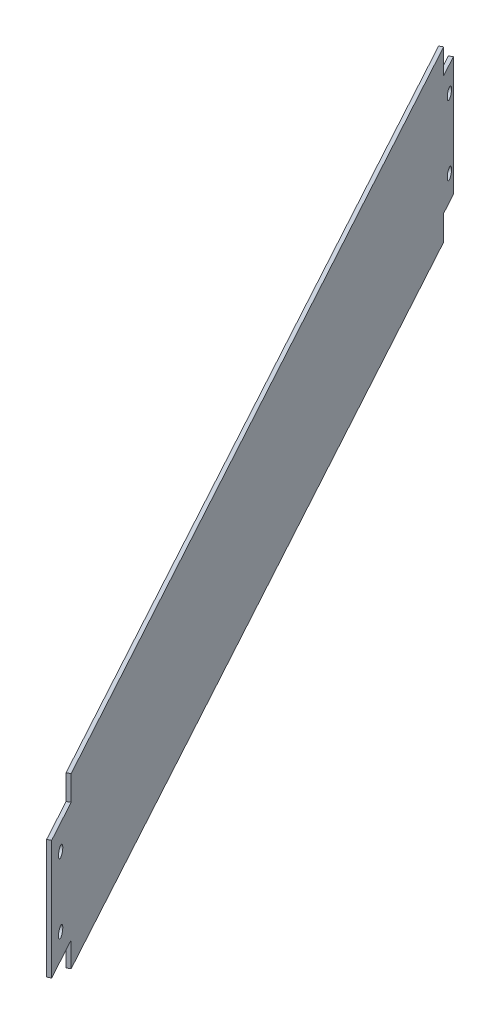
ISO-10303-21;
HEADER;
FILE_DESCRIPTION(('STEP AP214'),'2;1');
FILE_NAME('part.step','',(''),(''),'','','');
FILE_SCHEMA(('AUTOMOTIVE_DESIGN { 1 0 10303 214 1 1 1 1 }'));
ENDSEC;
DATA;
#1=APPLICATION_CONTEXT('core data for automotive mechanical design processes');
#2=APPLICATION_PROTOCOL_DEFINITION('international standard','automotive_design',2000,#1);
#3=PRODUCT_CONTEXT('',#1,'mechanical');
#4=PRODUCT('Part','Part','',(#3));
#5=PRODUCT_RELATED_PRODUCT_CATEGORY('part','',(#4));
#6=PRODUCT_DEFINITION_FORMATION('','',#4);
#7=PRODUCT_DEFINITION_CONTEXT('part definition',#1,'design');
#8=PRODUCT_DEFINITION('design','',#6,#7);
#9=PRODUCT_DEFINITION_SHAPE('','',#8);
#10=(LENGTH_UNIT() NAMED_UNIT(*) SI_UNIT(.MILLI.,.METRE.));
#11=(NAMED_UNIT(*) PLANE_ANGLE_UNIT() SI_UNIT($,.RADIAN.));
#12=(NAMED_UNIT(*) SI_UNIT($,.STERADIAN.) SOLID_ANGLE_UNIT());
#13=UNCERTAINTY_MEASURE_WITH_UNIT(LENGTH_MEASURE(1.E-05),#10,'distance_accuracy_value','');
#14=(GEOMETRIC_REPRESENTATION_CONTEXT(3) GLOBAL_UNCERTAINTY_ASSIGNED_CONTEXT((#13)) GLOBAL_UNIT_ASSIGNED_CONTEXT((#10,
#11,#12)) REPRESENTATION_CONTEXT('',''));
#15=CARTESIAN_POINT('',(0.,0.,0.));
#16=DIRECTION('',(0.,0.,1.));
#17=DIRECTION('',(1.,0.,0.));
#18=AXIS2_PLACEMENT_3D('',#15,#16,#17);
#19=CARTESIAN_POINT('',(63.,24.,-329.5));
#20=DIRECTION('',(0.878709626854143,0.,-0.477356671341097));
#21=DIRECTION('',(-0.477356671341097,0.,-0.878709626854143));
#22=AXIS2_PLACEMENT_3D('',#19,#20,#21);
#23=PLANE('',#22);
#24=DIRECTION('',(-0.477356671341097,0.,-0.878709626854143));
#25=VECTOR('',#24,1.);
#26=CARTESIAN_POINT('',(242.150424046724,-24.,0.276897896064776));
#27=LINE('',#26,#25);
#28=CARTESIAN_POINT('',(250.893268177586,-24.,16.3705690755053));
#29=VERTEX_POINT('',#28);
#30=CARTESIAN_POINT('',(241.574113099408,-24.,-0.783964992988662));
#31=VERTEX_POINT('',#30);
#32=EDGE_CURVE('E253',#29,#31,#27,.T.);
#33=ORIENTED_EDGE('',*,*,#32,.T.);
#34=DIRECTION('',(0.,1.,0.));
#35=VECTOR('',#34,1.);
#36=CARTESIAN_POINT('',(241.574113099408,-25.7671458676443,-0.783964992988717));
#37=LINE('',#36,#35);
#38=CARTESIAN_POINT('',(241.574113099408,-34.0342917352885,-0.783964992988551));
#39=VERTEX_POINT('',#38);
#40=EDGE_CURVE('E323',#31,#39,#37,.F.);
#41=ORIENTED_EDGE('',*,*,#40,.T.);
#42=DIRECTION('',(-0.477356671341098,0.,-0.878709626854143));
#43=VECTOR('',#42,1.);
#44=CARTESIAN_POINT('',(186.855607214927,-34.0342917352885,-101.508812417214));
#45=LINE('',#44,#43);
#46=CARTESIAN_POINT('',(63.1819355597183,-34.0342917352885,-329.165096274149));
#47=VERTEX_POINT('',#46);
#48=EDGE_CURVE('E315',#39,#47,#45,.T.);
#49=ORIENTED_EDGE('',*,*,#48,.T.);
#50=DIRECTION('',(0.,1.,0.));
#51=VECTOR('',#50,1.);
#52=CARTESIAN_POINT('',(63.1819355597188,-25.7671458676443,-329.165096274149));
#53=LINE('',#52,#51);
#54=CARTESIAN_POINT('',(63.1819355597188,-24.,-329.165096274149));
#55=VERTEX_POINT('',#54);
#56=EDGE_CURVE('E325',#47,#55,#53,.T.);
#57=ORIENTED_EDGE('',*,*,#56,.T.);
#58=DIRECTION('',(-0.477356671341097,0.,-0.878709626854143));
#59=VECTOR('',#58,1.);
#60=CARTESIAN_POINT('',(62.9146876378817,-24.,-329.65704147105));
#61=LINE('',#60,#59);
#62=CARTESIAN_POINT('',(58.5331652336936,-24.,-337.722469583788));
#63=VERTEX_POINT('',#62);
#64=EDGE_CURVE('E282',#55,#63,#61,.T.);
#65=ORIENTED_EDGE('',*,*,#64,.T.);
#66=DIRECTION('',(0.,-1.,0.));
#67=VECTOR('',#66,1.);
#68=CARTESIAN_POINT('',(58.5331652336936,24.,-337.722469583788));
#69=LINE('',#68,#67);
#70=CARTESIAN_POINT('',(58.5331652336936,24.,-337.722469583788));
#71=VERTEX_POINT('',#70);
#72=EDGE_CURVE('E277',#71,#63,#69,.T.);
#73=ORIENTED_EDGE('',*,*,#72,.F.);
#74=DIRECTION('',(-0.477356671341097,0.,-0.878709626854143));
#75=VECTOR('',#74,1.);
#76=CARTESIAN_POINT('',(62.9146876378817,24.,-329.65704147105));
#77=LINE('',#76,#75);
#78=CARTESIAN_POINT('',(63.1819355597188,24.,-329.165096274149));
#79=VERTEX_POINT('',#78);
#80=EDGE_CURVE('E284',#71,#79,#77,.F.);
#81=ORIENTED_EDGE('',*,*,#80,.T.);
#82=DIRECTION('',(0.,1.,0.));
#83=VECTOR('',#82,1.);
#84=CARTESIAN_POINT('',(63.1819355597188,25.7671458676443,-329.165096274149));
#85=LINE('',#84,#83);
#86=CARTESIAN_POINT('',(63.1819355597179,34.0342917352885,-329.165096274149));
#87=VERTEX_POINT('',#86);
#88=EDGE_CURVE('E302',#79,#87,#85,.T.);
#89=ORIENTED_EDGE('',*,*,#88,.T.);
#90=DIRECTION('',(0.477356671341098,0.,0.878709626854143));
#91=VECTOR('',#90,1.);
#92=CARTESIAN_POINT('',(186.855607214927,34.0342917352885,-101.508812417214));
#93=LINE('',#92,#91);
#94=CARTESIAN_POINT('',(241.574113099407,34.0342917352885,-0.783964992988329));
#95=VERTEX_POINT('',#94);
#96=EDGE_CURVE('E294',#87,#95,#93,.T.);
#97=ORIENTED_EDGE('',*,*,#96,.T.);
#98=DIRECTION('',(0.,1.,0.));
#99=VECTOR('',#98,1.);
#100=CARTESIAN_POINT('',(241.574113099408,25.7671458676443,-0.783964992988717));
#101=LINE('',#100,#99);
#102=CARTESIAN_POINT('',(241.574113099408,24.,-0.783964992988662));
#103=VERTEX_POINT('',#102);
#104=EDGE_CURVE('E304',#95,#103,#101,.F.);
#105=ORIENTED_EDGE('',*,*,#104,.T.);
#106=DIRECTION('',(-0.477356671341097,0.,-0.878709626854143));
#107=VECTOR('',#106,1.);
#108=CARTESIAN_POINT('',(242.150424046724,24.,0.276897896064776));
#109=LINE('',#108,#107);
#110=CARTESIAN_POINT('',(250.893268177586,24.,16.3705690755053));
#111=VERTEX_POINT('',#110);
#112=EDGE_CURVE('E251',#103,#111,#109,.F.);
#113=ORIENTED_EDGE('',*,*,#112,.T.);
#114=DIRECTION('',(0.,-1.,0.));
#115=VECTOR('',#114,1.);
#116=CARTESIAN_POINT('',(250.893268177586,24.,16.3705690755053));
#117=LINE('',#116,#115);
#118=EDGE_CURVE('E247',#111,#29,#117,.T.);
#119=ORIENTED_EDGE('',*,*,#118,.T.);
#120=EDGE_LOOP('',(#33,#41,#49,#57,#65,#73,#81,#89,#97,#105,#113,#119));
#121=FACE_BOUND('',#120,.T.);
#122=CARTESIAN_POINT('',(60.4425919190579,14.,-334.207631076371));
#123=DIRECTION('',(0.878709626854152,0.,-0.477356671341081));
#124=DIRECTION('',(-0.477356671341081,0.,-0.878709626854152));
#125=AXIS2_PLACEMENT_3D('',#122,#123,#124);
#126=CIRCLE('',#125,2.15);
#127=CARTESIAN_POINT('',(59.4162750756746,14.,-336.096856774108));
#128=VERTEX_POINT('',#127);
#129=EDGE_CURVE('E271',#128,#128,#126,.T.);
#130=ORIENTED_EDGE('',*,*,#129,.F.);
#131=EDGE_LOOP('',(#130));
#132=FACE_BOUND('',#131,.T.);
#133=CARTESIAN_POINT('',(60.4425919190579,-14.,-334.207631076371));
#134=DIRECTION('',(0.878709626854152,0.,-0.477356671341081));
#135=DIRECTION('',(-0.477356671341081,0.,-0.878709626854152));
#136=AXIS2_PLACEMENT_3D('',#133,#134,#135);
#137=CIRCLE('',#136,2.15);
#138=CARTESIAN_POINT('',(59.4162750756746,-14.,-336.096856774108));
#139=VERTEX_POINT('',#138);
#140=EDGE_CURVE('E274',#139,#139,#137,.T.);
#141=ORIENTED_EDGE('',*,*,#140,.F.);
#142=EDGE_LOOP('',(#141));
#143=FACE_BOUND('',#142,.T.);
#144=CARTESIAN_POINT('',(246.597058135517,14.,8.46218243381747));
#145=DIRECTION('',(0.8787096268542,0.,-0.477356671340993));
#146=DIRECTION('',(-0.477356671340993,0.,-0.8787096268542));
#147=AXIS2_PLACEMENT_3D('',#144,#145,#146);
#148=CIRCLE('',#147,2.14999999999999);
#149=CARTESIAN_POINT('',(245.570741292134,14.,6.57295673608095));
#150=VERTEX_POINT('',#149);
#151=EDGE_CURVE('E371',#150,#150,#148,.T.);
#152=ORIENTED_EDGE('',*,*,#151,.F.);
#153=EDGE_LOOP('',(#152));
#154=FACE_BOUND('',#153,.T.);
#155=CARTESIAN_POINT('',(246.597058135517,-14.,8.46218243381747));
#156=DIRECTION('',(0.8787096268542,0.,-0.477356671340993));
#157=DIRECTION('',(-0.477356671340993,0.,-0.8787096268542));
#158=AXIS2_PLACEMENT_3D('',#155,#156,#157);
#159=CIRCLE('',#158,2.14999999999999);
#160=CARTESIAN_POINT('',(245.570741292134,-14.,6.57295673608095));
#161=VERTEX_POINT('',#160);
#162=EDGE_CURVE('E242',#161,#161,#159,.T.);
#163=ORIENTED_EDGE('',*,*,#162,.F.);
#164=EDGE_LOOP('',(#163));
#165=FACE_BOUND('',#164,.T.);
#166=ADVANCED_FACE('F137',(#121,#132,#143,#154,#165),#23,.T.);
#167=CARTESIAN_POINT('',(61.6819355597188,24.,-328.783964992988));
#168=DIRECTION('',(0.878709626854143,0.,-0.477356671341097));
#169=DIRECTION('',(-0.477356671341097,0.,-0.878709626854143));
#170=AXIS2_PLACEMENT_3D('',#167,#168,#169);
#171=PLANE('',#170);
#172=DIRECTION('',(-0.477356671341097,0.,-0.878709626854143));
#173=VECTOR('',#172,1.);
#174=CARTESIAN_POINT('',(61.5966231976005,-24.,-328.941006464039));
#175=LINE('',#174,#173);
#176=CARTESIAN_POINT('',(61.8638711194376,-24.,-328.449061267137));
#177=VERTEX_POINT('',#176);
#178=CARTESIAN_POINT('',(57.2151007934123,-24.,-337.006434576776));
#179=VERTEX_POINT('',#178);
#180=EDGE_CURVE('E261',#177,#179,#175,.T.);
#181=ORIENTED_EDGE('',*,*,#180,.F.);
#182=DIRECTION('',(0.,1.,0.));
#183=VECTOR('',#182,1.);
#184=CARTESIAN_POINT('',(61.8638711194376,-25.7671458676443,-328.449061267137));
#185=LINE('',#184,#183);
#186=CARTESIAN_POINT('',(61.8638711194371,-34.0342917352885,-328.449061267137));
#187=VERTEX_POINT('',#186);
#188=EDGE_CURVE('E326',#187,#177,#185,.T.);
#189=ORIENTED_EDGE('',*,*,#188,.F.);
#190=DIRECTION('',(0.477356671341098,0.,0.878709626854143));
#191=VECTOR('',#190,1.);
#192=CARTESIAN_POINT('',(61.8638711194371,-34.0342917352885,-328.449061267137));
#193=LINE('',#192,#191);
#194=CARTESIAN_POINT('',(240.256048659127,-34.0342917352885,-0.0679299859768778));
#195=VERTEX_POINT('',#194);
#196=EDGE_CURVE('E308',#195,#187,#193,.F.);
#197=ORIENTED_EDGE('',*,*,#196,.F.);
#198=DIRECTION('',(0.,1.,0.));
#199=VECTOR('',#198,1.);
#200=CARTESIAN_POINT('',(240.256048659127,-25.7671458676443,-0.0679299859770999));
#201=LINE('',#200,#199);
#202=CARTESIAN_POINT('',(240.256048659127,-24.,-0.0679299859770999));
#203=VERTEX_POINT('',#202);
#204=EDGE_CURVE('E314',#203,#195,#201,.F.);
#205=ORIENTED_EDGE('',*,*,#204,.F.);
#206=DIRECTION('',(-0.477356671341097,0.,-0.878709626854143));
#207=VECTOR('',#206,1.);
#208=CARTESIAN_POINT('',(240.832359606443,-24.,0.992932903076393));
#209=LINE('',#208,#207);
#210=CARTESIAN_POINT('',(249.575203737305,-24.,17.0866040825167));
#211=VERTEX_POINT('',#210);
#212=EDGE_CURVE('E151',#211,#203,#209,.T.);
#213=ORIENTED_EDGE('',*,*,#212,.F.);
#214=DIRECTION('',(0.,-1.,0.));
#215=VECTOR('',#214,1.);
#216=CARTESIAN_POINT('',(249.575203737305,24.,17.0866040825167));
#217=LINE('',#216,#215);
#218=CARTESIAN_POINT('',(249.575203737305,24.,17.0866040825167));
#219=VERTEX_POINT('',#218);
#220=EDGE_CURVE('E236',#219,#211,#217,.T.);
#221=ORIENTED_EDGE('',*,*,#220,.F.);
#222=DIRECTION('',(-0.477356671341097,0.,-0.878709626854143));
#223=VECTOR('',#222,1.);
#224=CARTESIAN_POINT('',(240.832359606443,24.,0.992932903076393));
#225=LINE('',#224,#223);
#226=CARTESIAN_POINT('',(240.256048659127,24.,-0.0679299859770444));
#227=VERTEX_POINT('',#226);
#228=EDGE_CURVE('E225',#227,#219,#225,.F.);
#229=ORIENTED_EDGE('',*,*,#228,.F.);
#230=DIRECTION('',(0.,1.,0.));
#231=VECTOR('',#230,1.);
#232=CARTESIAN_POINT('',(240.256048659127,25.7671458676443,-0.0679299859770444));
#233=LINE('',#232,#231);
#234=CARTESIAN_POINT('',(240.256048659126,34.0342917352885,-0.0679299859766558));
#235=VERTEX_POINT('',#234);
#236=EDGE_CURVE('E305',#235,#227,#233,.F.);
#237=ORIENTED_EDGE('',*,*,#236,.F.);
#238=DIRECTION('',(-0.477356671341098,0.,-0.878709626854143));
#239=VECTOR('',#238,1.);
#240=CARTESIAN_POINT('',(240.256048659126,34.0342917352885,-0.0679299859766558));
#241=LINE('',#240,#239);
#242=CARTESIAN_POINT('',(61.8638711194367,34.0342917352885,-328.449061267137));
#243=VERTEX_POINT('',#242);
#244=EDGE_CURVE('E287',#243,#235,#241,.F.);
#245=ORIENTED_EDGE('',*,*,#244,.F.);
#246=DIRECTION('',(0.,1.,0.));
#247=VECTOR('',#246,1.);
#248=CARTESIAN_POINT('',(61.8638711194376,25.7671458676443,-328.449061267137));
#249=LINE('',#248,#247);
#250=CARTESIAN_POINT('',(61.8638711194367,24.,-328.449061267137));
#251=VERTEX_POINT('',#250);
#252=EDGE_CURVE('E293',#251,#243,#249,.T.);
#253=ORIENTED_EDGE('',*,*,#252,.F.);
#254=DIRECTION('',(-0.477356671341097,0.,-0.878709626854143));
#255=VECTOR('',#254,1.);
#256=CARTESIAN_POINT('',(61.5966231976005,24.,-328.941006464039));
#257=LINE('',#256,#255);
#258=CARTESIAN_POINT('',(57.2151007934123,24.,-337.006434576776));
#259=VERTEX_POINT('',#258);
#260=EDGE_CURVE('E159',#259,#251,#257,.F.);
#261=ORIENTED_EDGE('',*,*,#260,.F.);
#262=DIRECTION('',(0.,-1.,0.));
#263=VECTOR('',#262,1.);
#264=CARTESIAN_POINT('',(57.2151007934123,24.,-337.006434576776));
#265=LINE('',#264,#263);
#266=EDGE_CURVE('E258',#259,#179,#265,.T.);
#267=ORIENTED_EDGE('',*,*,#266,.T.);
#268=EDGE_LOOP('',(#181,#189,#197,#205,#213,#221,#229,#237,#245,#253,#261,#267));
#269=FACE_BOUND('',#268,.T.);
#270=CARTESIAN_POINT('',(59.1245274787767,14.,-333.49159606936));
#271=DIRECTION('',(0.878709626854152,0.,-0.477356671341081));
#272=DIRECTION('',(-0.477356671341081,0.,-0.878709626854152));
#273=AXIS2_PLACEMENT_3D('',#270,#271,#272);
#274=CIRCLE('',#273,2.15);
#275=CARTESIAN_POINT('',(58.0982106353934,14.,-335.380821767096));
#276=VERTEX_POINT('',#275);
#277=EDGE_CURVE('E265',#276,#276,#274,.T.);
#278=ORIENTED_EDGE('',*,*,#277,.T.);
#279=EDGE_LOOP('',(#278));
#280=FACE_BOUND('',#279,.T.);
#281=CARTESIAN_POINT('',(59.1245274787767,-14.,-333.49159606936));
#282=DIRECTION('',(0.878709626854152,0.,-0.477356671341081));
#283=DIRECTION('',(-0.477356671341081,0.,-0.878709626854152));
#284=AXIS2_PLACEMENT_3D('',#281,#282,#283);
#285=CIRCLE('',#284,2.15);
#286=CARTESIAN_POINT('',(58.0982106353934,-14.,-335.380821767096));
#287=VERTEX_POINT('',#286);
#288=EDGE_CURVE('E262',#287,#287,#285,.T.);
#289=ORIENTED_EDGE('',*,*,#288,.T.);
#290=EDGE_LOOP('',(#289));
#291=FACE_BOUND('',#290,.T.);
#292=CARTESIAN_POINT('',(245.278993695236,14.,9.17821744082892));
#293=DIRECTION('',(0.8787096268542,0.,-0.477356671340993));
#294=DIRECTION('',(-0.477356671340993,0.,-0.8787096268542));
#295=AXIS2_PLACEMENT_3D('',#292,#293,#294);
#296=CIRCLE('',#295,2.14999999999999);
#297=CARTESIAN_POINT('',(244.252676851853,14.,7.2889917430924));
#298=VERTEX_POINT('',#297);
#299=EDGE_CURVE('E370',#298,#298,#296,.T.);
#300=ORIENTED_EDGE('',*,*,#299,.T.);
#301=EDGE_LOOP('',(#300));
#302=FACE_BOUND('',#301,.T.);
#303=CARTESIAN_POINT('',(245.278993695236,-14.,9.17821744082892));
#304=DIRECTION('',(0.8787096268542,0.,-0.477356671340993));
#305=DIRECTION('',(-0.477356671340993,0.,-0.8787096268542));
#306=AXIS2_PLACEMENT_3D('',#303,#304,#305);
#307=CIRCLE('',#306,2.14999999999999);
#308=CARTESIAN_POINT('',(244.252676851853,-14.,7.2889917430924));
#309=VERTEX_POINT('',#308);
#310=EDGE_CURVE('E373',#309,#309,#307,.T.);
#311=ORIENTED_EDGE('',*,*,#310,.T.);
#312=EDGE_LOOP('',(#311));
#313=FACE_BOUND('',#312,.T.);
#314=ADVANCED_FACE('F238',(#269,#280,#291,#302,#313),#171,.F.);
#315=CARTESIAN_POINT('',(240.915080879268,-25.7671458676443,-0.425947489482936));
#316=DIRECTION('',(-0.477356671341097,0.,-0.878709626854143));
#317=DIRECTION('',(0.,1.,0.));
#318=AXIS2_PLACEMENT_3D('',#315,#316,#317);
#319=PLANE('',#318);
#320=DIRECTION('',(-0.878709626854203,0.,0.477356671340988));
#321=VECTOR('',#320,1.);
#322=CARTESIAN_POINT('',(241.574113099408,-24.,-0.783964992988606));
#323=LINE('',#322,#321);
#324=EDGE_CURVE('E13',#31,#203,#323,.T.);
#325=ORIENTED_EDGE('',*,*,#324,.T.);
#326=ORIENTED_EDGE('',*,*,#204,.T.);
#327=DIRECTION('',(-0.878709626854143,0.,0.477356671341098));
#328=VECTOR('',#327,1.);
#329=CARTESIAN_POINT('',(241.574113099408,-34.0342917352885,-0.783964992988551));
#330=LINE('',#329,#328);
#331=EDGE_CURVE('E318',#39,#195,#330,.T.);
#332=ORIENTED_EDGE('',*,*,#331,.F.);
#333=ORIENTED_EDGE('',*,*,#40,.F.);
#334=EDGE_LOOP('',(#325,#326,#332,#333));
#335=FACE_BOUND('',#334,.T.);
#336=ADVANCED_FACE('F368',(#335),#319,.F.);
#337=CARTESIAN_POINT('',(62.5229033395782,-25.7671458676443,-328.807078770643));
#338=DIRECTION('',(-0.477356671341097,0.,-0.878709626854143));
#339=DIRECTION('',(0.,1.,0.));
#340=AXIS2_PLACEMENT_3D('',#337,#338,#339);
#341=PLANE('',#340);
#342=ORIENTED_EDGE('',*,*,#188,.T.);
#343=DIRECTION('',(0.878709626854136,0.,-0.477356671341111));
#344=VECTOR('',#343,1.);
#345=CARTESIAN_POINT('',(61.8638711194376,-24.,-328.449061267137));
#346=LINE('',#345,#344);
#347=EDGE_CURVE('E329',#177,#55,#346,.T.);
#348=ORIENTED_EDGE('',*,*,#347,.T.);
#349=ORIENTED_EDGE('',*,*,#56,.F.);
#350=DIRECTION('',(-0.878709626854143,0.,0.477356671341098));
#351=VECTOR('',#350,1.);
#352=CARTESIAN_POINT('',(63.1819355597183,-34.0342917352885,-329.165096274149));
#353=LINE('',#352,#351);
#354=EDGE_CURVE('E311',#47,#187,#353,.T.);
#355=ORIENTED_EDGE('',*,*,#354,.T.);
#356=EDGE_LOOP('',(#342,#348,#349,#355));
#357=FACE_BOUND('',#356,.T.);
#358=ADVANCED_FACE('F360',(#357),#341,.T.);
#359=CARTESIAN_POINT('',(63.1819355597183,-34.0342917352885,-329.165096274149));
#360=DIRECTION('',(0.,1.,0.));
#361=DIRECTION('',(-0.477356671341098,0.,-0.878709626854143));
#362=AXIS2_PLACEMENT_3D('',#359,#360,#361);
#363=PLANE('',#362);
#364=ORIENTED_EDGE('',*,*,#196,.T.);
#365=ORIENTED_EDGE('',*,*,#354,.F.);
#366=ORIENTED_EDGE('',*,*,#48,.F.);
#367=ORIENTED_EDGE('',*,*,#331,.T.);
#368=EDGE_LOOP('',(#364,#365,#366,#367));
#369=FACE_BOUND('',#368,.T.);
#370=ADVANCED_FACE('F364',(#369),#363,.F.);
#371=CARTESIAN_POINT('',(62.5229033395782,25.7671458676443,-328.807078770643));
#372=DIRECTION('',(-0.477356671341097,0.,-0.878709626854143));
#373=DIRECTION('',(0.,1.,0.));
#374=AXIS2_PLACEMENT_3D('',#371,#372,#373);
#375=PLANE('',#374);
#376=DIRECTION('',(-0.878709626854136,0.,0.477356671341111));
#377=VECTOR('',#376,1.);
#378=CARTESIAN_POINT('',(63.1819355597188,24.,-329.165096274149));
#379=LINE('',#378,#377);
#380=EDGE_CURVE('E335',#79,#251,#379,.T.);
#381=ORIENTED_EDGE('',*,*,#380,.T.);
#382=ORIENTED_EDGE('',*,*,#252,.T.);
#383=DIRECTION('',(-0.878709626854143,0.,0.477356671341098));
#384=VECTOR('',#383,1.);
#385=CARTESIAN_POINT('',(63.181935559718,34.0342917352885,-329.165096274148));
#386=LINE('',#385,#384);
#387=EDGE_CURVE('E297',#87,#243,#386,.T.);
#388=ORIENTED_EDGE('',*,*,#387,.F.);
#389=ORIENTED_EDGE('',*,*,#88,.F.);
#390=EDGE_LOOP('',(#381,#382,#388,#389));
#391=FACE_BOUND('',#390,.T.);
#392=ADVANCED_FACE('F347',(#391),#375,.T.);
#393=CARTESIAN_POINT('',(240.915080879268,25.7671458676443,-0.425947489482881));
#394=DIRECTION('',(-0.477356671341097,0.,-0.878709626854143));
#395=DIRECTION('',(0.,1.,0.));
#396=AXIS2_PLACEMENT_3D('',#393,#394,#395);
#397=PLANE('',#396);
#398=ORIENTED_EDGE('',*,*,#236,.T.);
#399=DIRECTION('',(0.878709626854203,0.,-0.477356671340988));
#400=VECTOR('',#399,1.);
#401=CARTESIAN_POINT('',(240.256048659127,24.,-0.0679299859770999));
#402=LINE('',#401,#400);
#403=EDGE_CURVE('E144',#227,#103,#402,.T.);
#404=ORIENTED_EDGE('',*,*,#403,.T.);
#405=ORIENTED_EDGE('',*,*,#104,.F.);
#406=DIRECTION('',(-0.878709626854143,0.,0.477356671341098));
#407=VECTOR('',#406,1.);
#408=CARTESIAN_POINT('',(241.574113099407,34.0342917352885,-0.783964992988329));
#409=LINE('',#408,#407);
#410=EDGE_CURVE('E290',#95,#235,#409,.T.);
#411=ORIENTED_EDGE('',*,*,#410,.T.);
#412=EDGE_LOOP('',(#398,#404,#405,#411));
#413=FACE_BOUND('',#412,.T.);
#414=ADVANCED_FACE('F338',(#413),#397,.F.);
#415=CARTESIAN_POINT('',(241.574113099407,34.0342917352885,-0.783964992988329));
#416=DIRECTION('',(0.,-1.,0.));
#417=DIRECTION('',(-0.477356671341098,0.,-0.878709626854143));
#418=AXIS2_PLACEMENT_3D('',#415,#416,#417);
#419=PLANE('',#418);
#420=ORIENTED_EDGE('',*,*,#244,.T.);
#421=ORIENTED_EDGE('',*,*,#410,.F.);
#422=ORIENTED_EDGE('',*,*,#96,.F.);
#423=ORIENTED_EDGE('',*,*,#387,.T.);
#424=EDGE_LOOP('',(#420,#421,#422,#423));
#425=FACE_BOUND('',#424,.T.);
#426=ADVANCED_FACE('F342',(#425),#419,.F.);
#427=CARTESIAN_POINT('',(62.2556554177411,-24.,-329.299023967544));
#428=DIRECTION('',(0.,-1.,0.));
#429=DIRECTION('',(-0.477356671341097,0.,-0.878709626854143));
#430=AXIS2_PLACEMENT_3D('',#427,#428,#429);
#431=PLANE('',#430);
#432=ORIENTED_EDGE('',*,*,#347,.F.);
#433=ORIENTED_EDGE('',*,*,#180,.T.);
#434=DIRECTION('',(0.878709626854152,0.,-0.477356671341081));
#435=VECTOR('',#434,1.);
#436=CARTESIAN_POINT('',(57.2151007934123,-24.,-337.006434576776));
#437=LINE('',#436,#435);
#438=EDGE_CURVE('E268',#179,#63,#437,.T.);
#439=ORIENTED_EDGE('',*,*,#438,.T.);
#440=ORIENTED_EDGE('',*,*,#64,.F.);
#441=EDGE_LOOP('',(#432,#433,#439,#440));
#442=FACE_BOUND('',#441,.T.);
#443=ADVANCED_FACE('F357',(#442),#431,.T.);
#444=CARTESIAN_POINT('',(62.2556554177411,24.,-329.299023967544));
#445=DIRECTION('',(0.,-1.,0.));
#446=DIRECTION('',(-0.477356671341097,0.,-0.878709626854143));
#447=AXIS2_PLACEMENT_3D('',#444,#445,#446);
#448=PLANE('',#447);
#449=ORIENTED_EDGE('',*,*,#260,.T.);
#450=ORIENTED_EDGE('',*,*,#380,.F.);
#451=ORIENTED_EDGE('',*,*,#80,.F.);
#452=DIRECTION('',(0.878709626854152,0.,-0.477356671341081));
#453=VECTOR('',#452,1.);
#454=CARTESIAN_POINT('',(57.2151007934123,24.,-337.006434576776));
#455=LINE('',#454,#453);
#456=EDGE_CURVE('E255',#259,#71,#455,.T.);
#457=ORIENTED_EDGE('',*,*,#456,.F.);
#458=EDGE_LOOP('',(#449,#450,#451,#457));
#459=FACE_BOUND('',#458,.T.);
#460=ADVANCED_FACE('F352',(#459),#448,.F.);
#461=CARTESIAN_POINT('',(57.2151007934123,24.,-337.006434576776));
#462=DIRECTION('',(-0.477356671341081,0.,-0.878709626854152));
#463=DIRECTION('',(-0.878709626854152,0.,0.477356671341081));
#464=AXIS2_PLACEMENT_3D('',#461,#462,#463);
#465=PLANE('',#464);
#466=ORIENTED_EDGE('',*,*,#438,.F.);
#467=ORIENTED_EDGE('',*,*,#266,.F.);
#468=ORIENTED_EDGE('',*,*,#456,.T.);
#469=ORIENTED_EDGE('',*,*,#72,.T.);
#470=EDGE_LOOP('',(#466,#467,#468,#469));
#471=FACE_BOUND('',#470,.T.);
#472=ADVANCED_FACE('F351',(#471),#465,.T.);
#473=CARTESIAN_POINT('',(60.4425919190579,-14.,-334.207631076371));
#474=DIRECTION('',(0.878709626854152,0.,-0.477356671341081));
#475=DIRECTION('',(-0.477356671341081,0.,-0.878709626854152));
#476=AXIS2_PLACEMENT_3D('',#473,#474,#475);
#477=CYLINDRICAL_SURFACE('',#476,2.15);
#478=ORIENTED_EDGE('',*,*,#288,.F.);
#479=EDGE_LOOP('',(#478));
#480=FACE_BOUND('',#479,.T.);
#481=ORIENTED_EDGE('',*,*,#140,.T.);
#482=EDGE_LOOP('',(#481));
#483=FACE_BOUND('',#482,.T.);
#484=ADVANCED_FACE('F412',(#480,#483),#477,.F.);
#485=CARTESIAN_POINT('',(60.4425919190579,14.,-334.207631076371));
#486=DIRECTION('',(0.878709626854152,0.,-0.477356671341081));
#487=DIRECTION('',(-0.477356671341081,0.,-0.878709626854152));
#488=AXIS2_PLACEMENT_3D('',#485,#486,#487);
#489=CYLINDRICAL_SURFACE('',#488,2.15);
#490=ORIENTED_EDGE('',*,*,#277,.F.);
#491=EDGE_LOOP('',(#490));
#492=FACE_BOUND('',#491,.T.);
#493=ORIENTED_EDGE('',*,*,#129,.T.);
#494=EDGE_LOOP('',(#493));
#495=FACE_BOUND('',#494,.T.);
#496=ADVANCED_FACE('F409',(#492,#495),#489,.F.);
#497=CARTESIAN_POINT('',(241.491391826584,24.,0.634915399570612));
#498=DIRECTION('',(0.,-1.,0.));
#499=DIRECTION('',(-0.477356671341097,0.,-0.878709626854143));
#500=AXIS2_PLACEMENT_3D('',#497,#498,#499);
#501=PLANE('',#500);
#502=ORIENTED_EDGE('',*,*,#403,.F.);
#503=ORIENTED_EDGE('',*,*,#228,.T.);
#504=DIRECTION('',(-0.8787096268542,0.,0.477356671340993));
#505=VECTOR('',#504,1.);
#506=CARTESIAN_POINT('',(250.893268177586,24.,16.3705690755053));
#507=LINE('',#506,#505);
#508=EDGE_CURVE('E229',#111,#219,#507,.T.);
#509=ORIENTED_EDGE('',*,*,#508,.F.);
#510=ORIENTED_EDGE('',*,*,#112,.F.);
#511=EDGE_LOOP('',(#502,#503,#509,#510));
#512=FACE_BOUND('',#511,.T.);
#513=ADVANCED_FACE('F227',(#512),#501,.F.);
#514=CARTESIAN_POINT('',(241.491391826584,-24.,0.634915399570612));
#515=DIRECTION('',(0.,-1.,0.));
#516=DIRECTION('',(-0.477356671341097,0.,-0.878709626854143));
#517=AXIS2_PLACEMENT_3D('',#514,#515,#516);
#518=PLANE('',#517);
#519=ORIENTED_EDGE('',*,*,#212,.T.);
#520=ORIENTED_EDGE('',*,*,#324,.F.);
#521=ORIENTED_EDGE('',*,*,#32,.F.);
#522=DIRECTION('',(-0.8787096268542,0.,0.477356671340993));
#523=VECTOR('',#522,1.);
#524=CARTESIAN_POINT('',(250.893268177586,-24.,16.3705690755053));
#525=LINE('',#524,#523);
#526=EDGE_CURVE('E233',#29,#211,#525,.T.);
#527=ORIENTED_EDGE('',*,*,#526,.T.);
#528=EDGE_LOOP('',(#519,#520,#521,#527));
#529=FACE_BOUND('',#528,.T.);
#530=ADVANCED_FACE('F369',(#529),#518,.T.);
#531=CARTESIAN_POINT('',(250.893268177586,24.,16.3705690755053));
#532=DIRECTION('',(0.477356671340993,0.,0.8787096268542));
#533=DIRECTION('',(0.8787096268542,0.,-0.477356671340993));
#534=AXIS2_PLACEMENT_3D('',#531,#532,#533);
#535=PLANE('',#534);
#536=ORIENTED_EDGE('',*,*,#526,.F.);
#537=ORIENTED_EDGE('',*,*,#118,.F.);
#538=ORIENTED_EDGE('',*,*,#508,.T.);
#539=ORIENTED_EDGE('',*,*,#220,.T.);
#540=EDGE_LOOP('',(#536,#537,#538,#539));
#541=FACE_BOUND('',#540,.T.);
#542=ADVANCED_FACE('F245',(#541),#535,.T.);
#543=CARTESIAN_POINT('',(246.597058135517,-14.,8.46218243381747));
#544=DIRECTION('',(0.8787096268542,0.,-0.477356671340993));
#545=DIRECTION('',(-0.477356671340993,0.,-0.8787096268542));
#546=AXIS2_PLACEMENT_3D('',#543,#544,#545);
#547=CYLINDRICAL_SURFACE('',#546,2.14999999999999);
#548=ORIENTED_EDGE('',*,*,#310,.F.);
#549=EDGE_LOOP('',(#548));
#550=FACE_BOUND('',#549,.T.);
#551=ORIENTED_EDGE('',*,*,#162,.T.);
#552=EDGE_LOOP('',(#551));
#553=FACE_BOUND('',#552,.T.);
#554=ADVANCED_FACE('F384',(#550,#553),#547,.F.);
#555=CARTESIAN_POINT('',(246.597058135517,14.,8.46218243381747));
#556=DIRECTION('',(0.8787096268542,0.,-0.477356671340993));
#557=DIRECTION('',(-0.477356671340993,0.,-0.8787096268542));
#558=AXIS2_PLACEMENT_3D('',#555,#556,#557);
#559=CYLINDRICAL_SURFACE('',#558,2.14999999999999);
#560=ORIENTED_EDGE('',*,*,#299,.F.);
#561=EDGE_LOOP('',(#560));
#562=FACE_BOUND('',#561,.T.);
#563=ORIENTED_EDGE('',*,*,#151,.T.);
#564=EDGE_LOOP('',(#563));
#565=FACE_BOUND('',#564,.T.);
#566=ADVANCED_FACE('F423',(#562,#565),#559,.F.);
#567=CLOSED_SHELL('',(#166,#314,#336,#358,#370,#392,#414,#426,#443,#460,#472,#484,#496,#513,
#530,#542,#554,#566));
#568=MANIFOLD_SOLID_BREP('B2',#567);
#569=ADVANCED_BREP_SHAPE_REPRESENTATION('',(#18,#568),#14);
#570=SHAPE_DEFINITION_REPRESENTATION(#9,#569);
ENDSEC;
END-ISO-10303-21;
